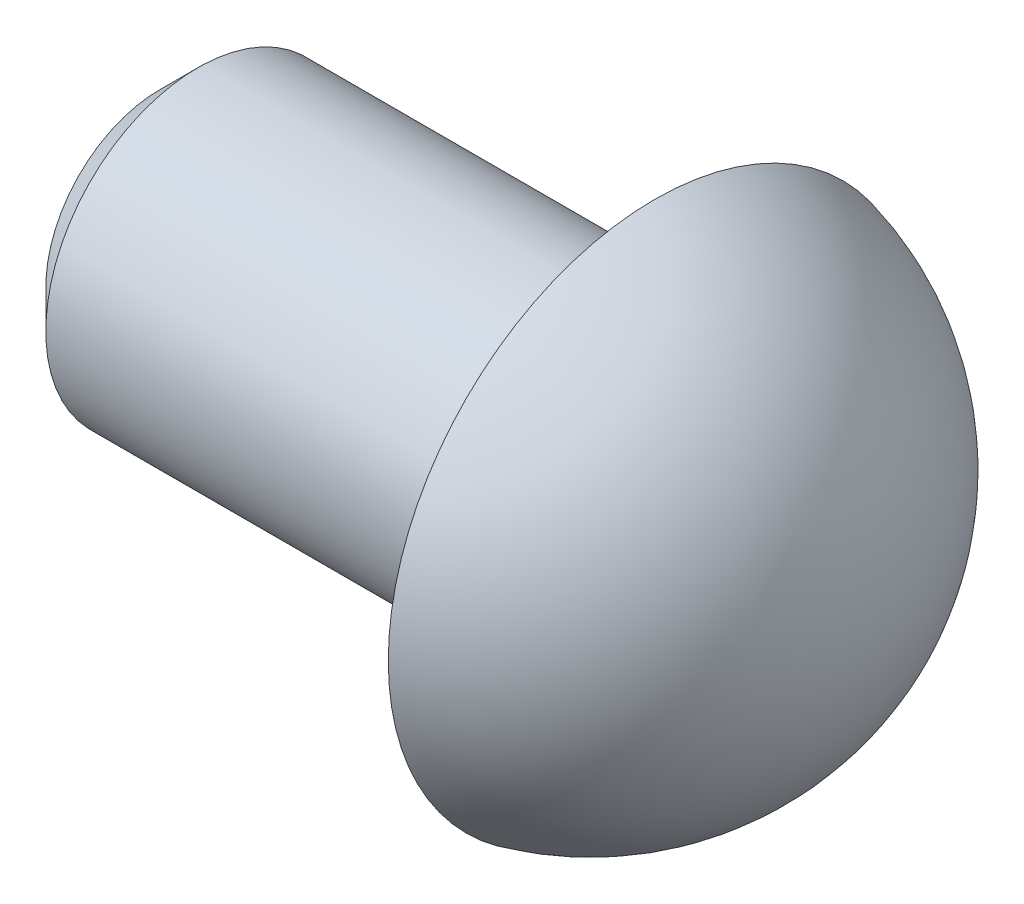
ISO-10303-21;
HEADER;
FILE_DESCRIPTION(('STEP AP214'),'2;1');
FILE_NAME('part.step','',(''),(''),'','','');
FILE_SCHEMA(('AUTOMOTIVE_DESIGN { 1 0 10303 214 1 1 1 1 }'));
ENDSEC;
DATA;
#1=APPLICATION_CONTEXT('core data for automotive mechanical design processes');
#2=APPLICATION_PROTOCOL_DEFINITION('international standard','automotive_design',2000,#1);
#3=PRODUCT_CONTEXT('',#1,'mechanical');
#4=PRODUCT('Part','Part','',(#3));
#5=PRODUCT_RELATED_PRODUCT_CATEGORY('part','',(#4));
#6=PRODUCT_DEFINITION_FORMATION('','',#4);
#7=PRODUCT_DEFINITION_CONTEXT('part definition',#1,'design');
#8=PRODUCT_DEFINITION('design','',#6,#7);
#9=PRODUCT_DEFINITION_SHAPE('','',#8);
#10=(LENGTH_UNIT() NAMED_UNIT(*) SI_UNIT(.MILLI.,.METRE.));
#11=(NAMED_UNIT(*) PLANE_ANGLE_UNIT() SI_UNIT($,.RADIAN.));
#12=(NAMED_UNIT(*) SI_UNIT($,.STERADIAN.) SOLID_ANGLE_UNIT());
#13=UNCERTAINTY_MEASURE_WITH_UNIT(LENGTH_MEASURE(1.E-05),#10,'distance_accuracy_value','');
#14=(GEOMETRIC_REPRESENTATION_CONTEXT(3) GLOBAL_UNCERTAINTY_ASSIGNED_CONTEXT((#13)) GLOBAL_UNIT_ASSIGNED_CONTEXT((#10,
#11,#12)) REPRESENTATION_CONTEXT('',''));
#15=CARTESIAN_POINT('',(0.,0.,0.));
#16=DIRECTION('',(0.,0.,1.));
#17=DIRECTION('',(1.,0.,0.));
#18=AXIS2_PLACEMENT_3D('',#15,#16,#17);
#19=CARTESIAN_POINT('',(-6.5,0.,0.));
#20=DIRECTION('',(1.,0.,0.));
#21=DIRECTION('',(0.,0.,-1.));
#22=AXIS2_PLACEMENT_3D('',#19,#20,#21);
#23=CYLINDRICAL_SURFACE('',#22,2.);
#24=CARTESIAN_POINT('',(-6.,0.,0.));
#25=DIRECTION('',(1.,0.,0.));
#26=DIRECTION('',(0.,0.,-1.));
#27=AXIS2_PLACEMENT_3D('',#24,#25,#26);
#28=CIRCLE('',#27,2.);
#29=CARTESIAN_POINT('',(-6.,0.,-2.));
#30=VERTEX_POINT('',#29);
#31=EDGE_CURVE('E37',#30,#30,#28,.T.);
#32=CARTESIAN_POINT('',(0.,0.,0.));
#33=DIRECTION('',(1.,0.,0.));
#34=DIRECTION('',(0.,0.,-1.));
#35=AXIS2_PLACEMENT_3D('',#32,#33,#34);
#36=CIRCLE('',#35,2.);
#37=CARTESIAN_POINT('',(0.,0.,-2.));
#38=VERTEX_POINT('',#37);
#39=EDGE_CURVE('E41',#38,#38,#36,.T.);
#40=CARTESIAN_POINT('',(-6.,0.,-2.));
#41=CARTESIAN_POINT('',(-5.9375,0.,-2.));
#42=CARTESIAN_POINT('',(-5.875,0.,-2.));
#43=CARTESIAN_POINT('',(-5.75,0.,-2.));
#44=CARTESIAN_POINT('',(-5.6875,0.,-2.));
#45=CARTESIAN_POINT('',(-5.5625,0.,-2.));
#46=CARTESIAN_POINT('',(-5.5,0.,-2.));
#47=CARTESIAN_POINT('',(-5.375,0.,-2.));
#48=CARTESIAN_POINT('',(-5.3125,0.,-2.));
#49=CARTESIAN_POINT('',(-5.1875,0.,-2.));
#50=CARTESIAN_POINT('',(-5.125,0.,-2.));
#51=CARTESIAN_POINT('',(-5.,0.,-2.));
#52=CARTESIAN_POINT('',(-4.9375,0.,-2.));
#53=CARTESIAN_POINT('',(-4.8125,0.,-2.));
#54=CARTESIAN_POINT('',(-4.75,0.,-2.));
#55=CARTESIAN_POINT('',(-4.625,0.,-2.));
#56=CARTESIAN_POINT('',(-4.5625,0.,-2.));
#57=CARTESIAN_POINT('',(-4.4375,0.,-2.));
#58=CARTESIAN_POINT('',(-4.375,0.,-2.));
#59=CARTESIAN_POINT('',(-4.25,0.,-2.));
#60=CARTESIAN_POINT('',(-4.1875,0.,-2.));
#61=CARTESIAN_POINT('',(-4.0625,0.,-2.));
#62=CARTESIAN_POINT('',(-4.,0.,-2.));
#63=CARTESIAN_POINT('',(-3.875,0.,-2.));
#64=CARTESIAN_POINT('',(-3.8125,0.,-2.));
#65=CARTESIAN_POINT('',(-3.6875,0.,-2.));
#66=CARTESIAN_POINT('',(-3.625,0.,-2.));
#67=CARTESIAN_POINT('',(-3.5,0.,-2.));
#68=CARTESIAN_POINT('',(-3.4375,0.,-2.));
#69=CARTESIAN_POINT('',(-3.3125,0.,-2.));
#70=CARTESIAN_POINT('',(-3.25,0.,-2.));
#71=CARTESIAN_POINT('',(-3.125,0.,-2.));
#72=CARTESIAN_POINT('',(-3.0625,0.,-2.));
#73=CARTESIAN_POINT('',(-2.9375,0.,-2.));
#74=CARTESIAN_POINT('',(-2.875,0.,-2.));
#75=CARTESIAN_POINT('',(-2.75,0.,-2.));
#76=CARTESIAN_POINT('',(-2.6875,0.,-2.));
#77=CARTESIAN_POINT('',(-2.5625,0.,-2.));
#78=CARTESIAN_POINT('',(-2.5,0.,-2.));
#79=CARTESIAN_POINT('',(-2.375,0.,-2.));
#80=CARTESIAN_POINT('',(-2.3125,0.,-2.));
#81=CARTESIAN_POINT('',(-2.1875,0.,-2.));
#82=CARTESIAN_POINT('',(-2.125,0.,-2.));
#83=CARTESIAN_POINT('',(-2.,0.,-2.));
#84=CARTESIAN_POINT('',(-1.9375,0.,-2.));
#85=CARTESIAN_POINT('',(-1.8125,0.,-2.));
#86=CARTESIAN_POINT('',(-1.75,0.,-2.));
#87=CARTESIAN_POINT('',(-1.625,0.,-2.));
#88=CARTESIAN_POINT('',(-1.5625,0.,-2.));
#89=CARTESIAN_POINT('',(-1.4375,0.,-2.));
#90=CARTESIAN_POINT('',(-1.375,0.,-2.));
#91=CARTESIAN_POINT('',(-1.25,0.,-2.));
#92=CARTESIAN_POINT('',(-1.1875,0.,-2.));
#93=CARTESIAN_POINT('',(-1.0625,0.,-2.));
#94=CARTESIAN_POINT('',(-0.999999999999999,0.,-2.));
#95=CARTESIAN_POINT('',(-0.874999999999999,0.,-2.));
#96=CARTESIAN_POINT('',(-0.8125,0.,-2.));
#97=CARTESIAN_POINT('',(-0.6875,0.,-2.));
#98=CARTESIAN_POINT('',(-0.625,0.,-2.));
#99=CARTESIAN_POINT('',(-0.5,0.,-2.));
#100=CARTESIAN_POINT('',(-0.4375,0.,-2.));
#101=CARTESIAN_POINT('',(-0.3125,0.,-2.));
#102=CARTESIAN_POINT('',(-0.25,0.,-2.));
#103=CARTESIAN_POINT('',(-0.125,0.,-2.));
#104=CARTESIAN_POINT('',(-0.0625000000000001,0.,-2.));
#105=CARTESIAN_POINT('',(0.,0.,-2.));
#106=B_SPLINE_CURVE_WITH_KNOTS('',3,(#40,#41,#42,#43,#44,#45,#46,#47,#48,#49,#50,#51,#52,#53,
#54,#55,#56,#57,#58,#59,#60,#61,#62,#63,#64,#65,#66,#67,#68,#69,#70,#71,#72,#73,#74,#75,#76,#77,
#78,#79,#80,#81,#82,#83,#84,#85,#86,#87,#88,#89,#90,#91,#92,#93,#94,#95,#96,#97,#98,#99,#100,
#101,#102,#103,#104,#105),.UNSPECIFIED.,.F.,.F.,(4,2,2,2,2,2,2,2,2,2,2,2,2,2,2,2,2,2,2,2,2,2,2,
2,2,2,2,2,2,2,2,2,4),(0.,0.187499999999999,0.374999999999999,0.5625,0.749999999999999,
0.937499999999999,1.125,1.3125,1.5,1.6875,1.875,2.0625,2.25,2.4375,2.625,2.8125,3.,3.1875,3.375,
3.5625,3.75,3.9375,4.125,4.3125,4.5,4.6875,4.875,5.0625,5.25,5.4375,5.625,5.8125,6.),.UNSPECIFIED.);
#107=EDGE_CURVE('BSEAM30',#30,#38,#106,.T.);
#108=ORIENTED_EDGE('',*,*,#31,.T.);
#109=ORIENTED_EDGE('',*,*,#39,.F.);
#110=ORIENTED_EDGE('',*,*,#107,.T.);
#111=ORIENTED_EDGE('',*,*,#107,.F.);
#112=EDGE_LOOP('',(#108,#110,#109,#111));
#113=FACE_BOUND('',#112,.T.);
#114=ADVANCED_FACE('F30',(#113),#23,.T.);
#115=CARTESIAN_POINT('',(-6.5,0.,0.));
#116=DIRECTION('',(1.,0.,0.));
#117=DIRECTION('',(0.,0.,-1.));
#118=AXIS2_PLACEMENT_3D('',#115,#116,#117);
#119=PLANE('',#118);
#120=CARTESIAN_POINT('',(-6.5,0.,0.));
#121=DIRECTION('',(1.,0.,0.));
#122=DIRECTION('',(0.,0.,-1.));
#123=AXIS2_PLACEMENT_3D('',#120,#121,#122);
#124=CIRCLE('',#123,1.49999999999999);
#125=CARTESIAN_POINT('',(-6.5,0.,-1.49999999999999));
#126=VERTEX_POINT('',#125);
#127=EDGE_CURVE('E10',#126,#126,#124,.F.);
#128=ORIENTED_EDGE('',*,*,#127,.T.);
#129=EDGE_LOOP('',(#128));
#130=FACE_BOUND('',#129,.T.);
#131=ADVANCED_FACE('F55',(#130),#119,.F.);
#132=CARTESIAN_POINT('',(-0.842614977317635,0.,0.));
#133=DIRECTION('',(-1.,0.,0.));
#134=DIRECTION('',(0.,0.,-1.));
#135=AXIS2_PLACEMENT_3D('',#132,#133,#134);
#136=SPHERICAL_SURFACE('',#135,3.6);
#137=CARTESIAN_POINT('',(0.,0.,0.));
#138=DIRECTION('',(-1.,0.,0.));
#139=DIRECTION('',(0.,0.,1.));
#140=AXIS2_PLACEMENT_3D('',#137,#138,#139);
#141=CIRCLE('',#140,3.5);
#142=CARTESIAN_POINT('',(0.,0.,3.5));
#143=VERTEX_POINT('',#142);
#144=EDGE_CURVE('E45',#143,#143,#141,.T.);
#145=ORIENTED_EDGE('',*,*,#144,.F.);
#146=EDGE_LOOP('',(#145));
#147=FACE_BOUND('',#146,.T.);
#148=ADVANCED_FACE('F53',(#147),#136,.T.);
#149=CARTESIAN_POINT('',(0.,0.,0.));
#150=DIRECTION('',(1.,0.,0.));
#151=DIRECTION('',(0.,0.,-1.));
#152=AXIS2_PLACEMENT_3D('',#149,#150,#151);
#153=PLANE('',#152);
#154=ORIENTED_EDGE('',*,*,#39,.T.);
#155=EDGE_LOOP('',(#154));
#156=FACE_BOUND('',#155,.T.);
#157=ORIENTED_EDGE('',*,*,#144,.T.);
#158=EDGE_LOOP('',(#157));
#159=FACE_BOUND('',#158,.T.);
#160=ADVANCED_FACE('F51',(#156,#159),#153,.F.);
#161=CARTESIAN_POINT('',(-6.,0.,0.));
#162=DIRECTION('',(1.,0.,0.));
#163=DIRECTION('',(0.,0.,-1.));
#164=AXIS2_PLACEMENT_3D('',#161,#162,#163);
#165=CONICAL_SURFACE('',#164,2.,0.78539816339745);
#166=ORIENTED_EDGE('',*,*,#127,.F.);
#167=EDGE_LOOP('',(#166));
#168=FACE_BOUND('',#167,.T.);
#169=ORIENTED_EDGE('',*,*,#31,.F.);
#170=EDGE_LOOP('',(#169));
#171=FACE_BOUND('',#170,.T.);
#172=ADVANCED_FACE('F32',(#168,#171),#165,.T.);
#173=CLOSED_SHELL('',(#114,#131,#148,#160,#172));
#174=MANIFOLD_SOLID_BREP('B2',#173);
#175=ADVANCED_BREP_SHAPE_REPRESENTATION('',(#18,#174),#14);
#176=SHAPE_DEFINITION_REPRESENTATION(#9,#175);
ENDSEC;
END-ISO-10303-21;
